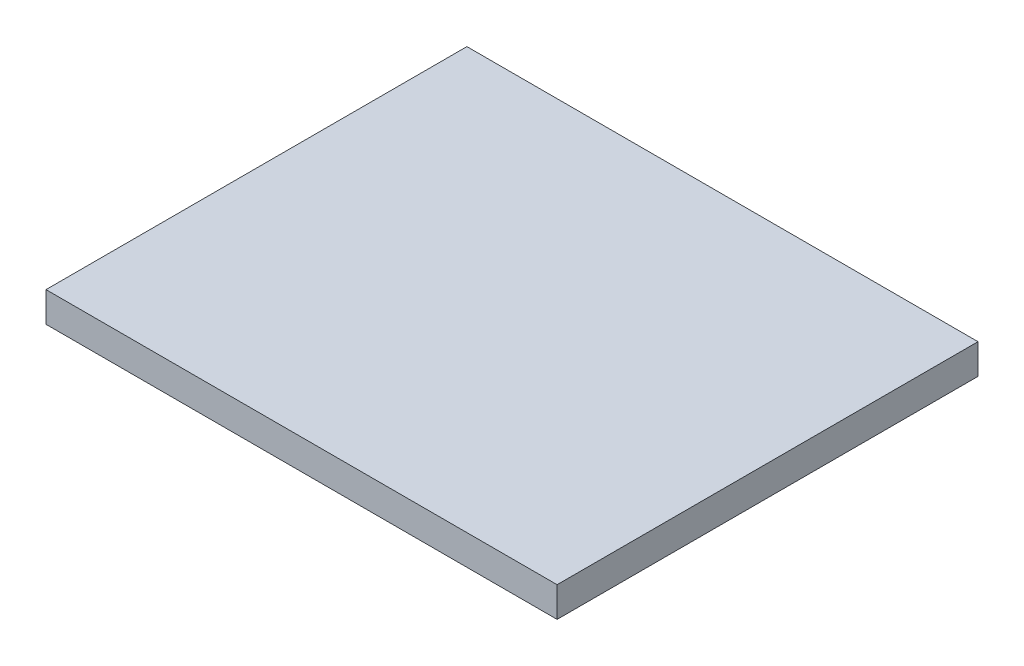
ISO-10303-21;
HEADER;
FILE_DESCRIPTION(('STEP AP214'),'2;1');
FILE_NAME('part.step','',(''),(''),'','','');
FILE_SCHEMA(('AUTOMOTIVE_DESIGN { 1 0 10303 214 1 1 1 1 }'));
ENDSEC;
DATA;
#1=APPLICATION_CONTEXT('core data for automotive mechanical design processes');
#2=APPLICATION_PROTOCOL_DEFINITION('international standard','automotive_design',2000,#1);
#3=PRODUCT_CONTEXT('',#1,'mechanical');
#4=PRODUCT('Part','Part','',(#3));
#5=PRODUCT_RELATED_PRODUCT_CATEGORY('part','',(#4));
#6=PRODUCT_DEFINITION_FORMATION('','',#4);
#7=PRODUCT_DEFINITION_CONTEXT('part definition',#1,'design');
#8=PRODUCT_DEFINITION('design','',#6,#7);
#9=PRODUCT_DEFINITION_SHAPE('','',#8);
#10=(LENGTH_UNIT() NAMED_UNIT(*) SI_UNIT(.MILLI.,.METRE.));
#11=(NAMED_UNIT(*) PLANE_ANGLE_UNIT() SI_UNIT($,.RADIAN.));
#12=(NAMED_UNIT(*) SI_UNIT($,.STERADIAN.) SOLID_ANGLE_UNIT());
#13=UNCERTAINTY_MEASURE_WITH_UNIT(LENGTH_MEASURE(1.E-05),#10,'distance_accuracy_value','');
#14=(GEOMETRIC_REPRESENTATION_CONTEXT(3) GLOBAL_UNCERTAINTY_ASSIGNED_CONTEXT((#13)) GLOBAL_UNIT_ASSIGNED_CONTEXT((#10,
#11,#12)) REPRESENTATION_CONTEXT('',''));
#15=CARTESIAN_POINT('',(0.,0.,0.));
#16=DIRECTION('',(0.,0.,1.));
#17=DIRECTION('',(1.,0.,0.));
#18=AXIS2_PLACEMENT_3D('',#15,#16,#17);
#19=CARTESIAN_POINT('',(-85.,10.,-70.));
#20=DIRECTION('',(0.,0.,-1.));
#21=DIRECTION('',(-1.,0.,0.));
#22=AXIS2_PLACEMENT_3D('',#19,#20,#21);
#23=PLANE('',#22);
#24=DIRECTION('',(1.,0.,0.));
#25=VECTOR('',#24,1.);
#26=CARTESIAN_POINT('',(-85.,0.,-70.));
#27=LINE('',#26,#25);
#28=CARTESIAN_POINT('',(-85.,0.,-70.));
#29=VERTEX_POINT('',#28);
#30=CARTESIAN_POINT('',(85.,0.,-70.));
#31=VERTEX_POINT('',#30);
#32=EDGE_CURVE('E97',#29,#31,#27,.T.);
#33=ORIENTED_EDGE('',*,*,#32,.F.);
#34=DIRECTION('',(0.,-1.,0.));
#35=VECTOR('',#34,1.);
#36=CARTESIAN_POINT('',(-85.,10.,-70.));
#37=LINE('',#36,#35);
#38=CARTESIAN_POINT('',(-85.,10.,-70.));
#39=VERTEX_POINT('',#38);
#40=EDGE_CURVE('E11',#39,#29,#37,.T.);
#41=ORIENTED_EDGE('',*,*,#40,.F.);
#42=DIRECTION('',(1.,0.,0.));
#43=VECTOR('',#42,1.);
#44=CARTESIAN_POINT('',(-85.,10.,-70.));
#45=LINE('',#44,#43);
#46=CARTESIAN_POINT('',(85.,10.,-70.));
#47=VERTEX_POINT('',#46);
#48=EDGE_CURVE('E92',#39,#47,#45,.T.);
#49=ORIENTED_EDGE('',*,*,#48,.T.);
#50=DIRECTION('',(0.,-1.,0.));
#51=VECTOR('',#50,1.);
#52=CARTESIAN_POINT('',(85.,10.,-70.));
#53=LINE('',#52,#51);
#54=EDGE_CURVE('E35',#47,#31,#53,.T.);
#55=ORIENTED_EDGE('',*,*,#54,.T.);
#56=EDGE_LOOP('',(#33,#41,#49,#55));
#57=FACE_BOUND('',#56,.T.);
#58=ADVANCED_FACE('F32',(#57),#23,.T.);
#59=CARTESIAN_POINT('',(-85.,10.,-70.));
#60=DIRECTION('',(1.,0.,0.));
#61=DIRECTION('',(0.,0.,-1.));
#62=AXIS2_PLACEMENT_3D('',#59,#60,#61);
#63=PLANE('',#62);
#64=DIRECTION('',(0.,0.,1.));
#65=VECTOR('',#64,1.);
#66=CARTESIAN_POINT('',(-85.,0.,-70.));
#67=LINE('',#66,#65);
#68=CARTESIAN_POINT('',(-85.,0.,70.));
#69=VERTEX_POINT('',#68);
#70=EDGE_CURVE('E65',#29,#69,#67,.T.);
#71=ORIENTED_EDGE('',*,*,#70,.T.);
#72=DIRECTION('',(0.,-1.,0.));
#73=VECTOR('',#72,1.);
#74=CARTESIAN_POINT('',(-85.,10.,70.));
#75=LINE('',#74,#73);
#76=CARTESIAN_POINT('',(-85.,10.,70.));
#77=VERTEX_POINT('',#76);
#78=EDGE_CURVE('E41',#77,#69,#75,.T.);
#79=ORIENTED_EDGE('',*,*,#78,.F.);
#80=DIRECTION('',(0.,0.,1.));
#81=VECTOR('',#80,1.);
#82=CARTESIAN_POINT('',(-85.,10.,-70.));
#83=LINE('',#82,#81);
#84=EDGE_CURVE('E82',#39,#77,#83,.T.);
#85=ORIENTED_EDGE('',*,*,#84,.F.);
#86=ORIENTED_EDGE('',*,*,#40,.T.);
#87=EDGE_LOOP('',(#71,#79,#85,#86));
#88=FACE_BOUND('',#87,.T.);
#89=ADVANCED_FACE('F107',(#88),#63,.F.);
#90=CARTESIAN_POINT('',(-85.,10.,70.));
#91=DIRECTION('',(0.,0.,-1.));
#92=DIRECTION('',(-1.,0.,0.));
#93=AXIS2_PLACEMENT_3D('',#90,#91,#92);
#94=PLANE('',#93);
#95=DIRECTION('',(1.,0.,0.));
#96=VECTOR('',#95,1.);
#97=CARTESIAN_POINT('',(-85.,0.,70.));
#98=LINE('',#97,#96);
#99=CARTESIAN_POINT('',(85.,0.,70.));
#100=VERTEX_POINT('',#99);
#101=EDGE_CURVE('E89',#69,#100,#98,.T.);
#102=ORIENTED_EDGE('',*,*,#101,.T.);
#103=DIRECTION('',(0.,-1.,0.));
#104=VECTOR('',#103,1.);
#105=CARTESIAN_POINT('',(85.,10.,70.));
#106=LINE('',#105,#104);
#107=CARTESIAN_POINT('',(85.,10.,70.));
#108=VERTEX_POINT('',#107);
#109=EDGE_CURVE('E86',#108,#100,#106,.T.);
#110=ORIENTED_EDGE('',*,*,#109,.F.);
#111=DIRECTION('',(1.,0.,0.));
#112=VECTOR('',#111,1.);
#113=CARTESIAN_POINT('',(-85.,10.,70.));
#114=LINE('',#113,#112);
#115=EDGE_CURVE('E77',#77,#108,#114,.T.);
#116=ORIENTED_EDGE('',*,*,#115,.F.);
#117=ORIENTED_EDGE('',*,*,#78,.T.);
#118=EDGE_LOOP('',(#102,#110,#116,#117));
#119=FACE_BOUND('',#118,.T.);
#120=ADVANCED_FACE('F87',(#119),#94,.F.);
#121=CARTESIAN_POINT('',(85.,10.,-70.));
#122=DIRECTION('',(1.,0.,0.));
#123=DIRECTION('',(0.,0.,-1.));
#124=AXIS2_PLACEMENT_3D('',#121,#122,#123);
#125=PLANE('',#124);
#126=DIRECTION('',(0.,0.,1.));
#127=VECTOR('',#126,1.);
#128=CARTESIAN_POINT('',(85.,0.,-70.));
#129=LINE('',#128,#127);
#130=EDGE_CURVE('E100',#31,#100,#129,.T.);
#131=ORIENTED_EDGE('',*,*,#130,.F.);
#132=ORIENTED_EDGE('',*,*,#54,.F.);
#133=DIRECTION('',(0.,0.,1.));
#134=VECTOR('',#133,1.);
#135=CARTESIAN_POINT('',(85.,10.,-70.));
#136=LINE('',#135,#134);
#137=EDGE_CURVE('E81',#47,#108,#136,.T.);
#138=ORIENTED_EDGE('',*,*,#137,.T.);
#139=ORIENTED_EDGE('',*,*,#109,.T.);
#140=EDGE_LOOP('',(#131,#132,#138,#139));
#141=FACE_BOUND('',#140,.T.);
#142=ADVANCED_FACE('F91',(#141),#125,.T.);
#143=CARTESIAN_POINT('',(0.,10.,0.));
#144=DIRECTION('',(0.,-1.,0.));
#145=DIRECTION('',(0.,0.,-1.));
#146=AXIS2_PLACEMENT_3D('',#143,#144,#145);
#147=PLANE('',#146);
#148=ORIENTED_EDGE('',*,*,#48,.F.);
#149=ORIENTED_EDGE('',*,*,#84,.T.);
#150=ORIENTED_EDGE('',*,*,#115,.T.);
#151=ORIENTED_EDGE('',*,*,#137,.F.);
#152=EDGE_LOOP('',(#148,#149,#150,#151));
#153=FACE_BOUND('',#152,.T.);
#154=ADVANCED_FACE('F80',(#153),#147,.F.);
#155=CARTESIAN_POINT('',(0.,0.,0.));
#156=DIRECTION('',(0.,-1.,0.));
#157=DIRECTION('',(0.,0.,-1.));
#158=AXIS2_PLACEMENT_3D('',#155,#156,#157);
#159=PLANE('',#158);
#160=ORIENTED_EDGE('',*,*,#32,.T.);
#161=ORIENTED_EDGE('',*,*,#130,.T.);
#162=ORIENTED_EDGE('',*,*,#101,.F.);
#163=ORIENTED_EDGE('',*,*,#70,.F.);
#164=EDGE_LOOP('',(#160,#161,#162,#163));
#165=FACE_BOUND('',#164,.T.);
#166=ADVANCED_FACE('F105',(#165),#159,.T.);
#167=CLOSED_SHELL('',(#58,#89,#120,#142,#154,#166));
#168=MANIFOLD_SOLID_BREP('B2',#167);
#169=ADVANCED_BREP_SHAPE_REPRESENTATION('',(#18,#168),#14);
#170=SHAPE_DEFINITION_REPRESENTATION(#9,#169);
ENDSEC;
END-ISO-10303-21;
